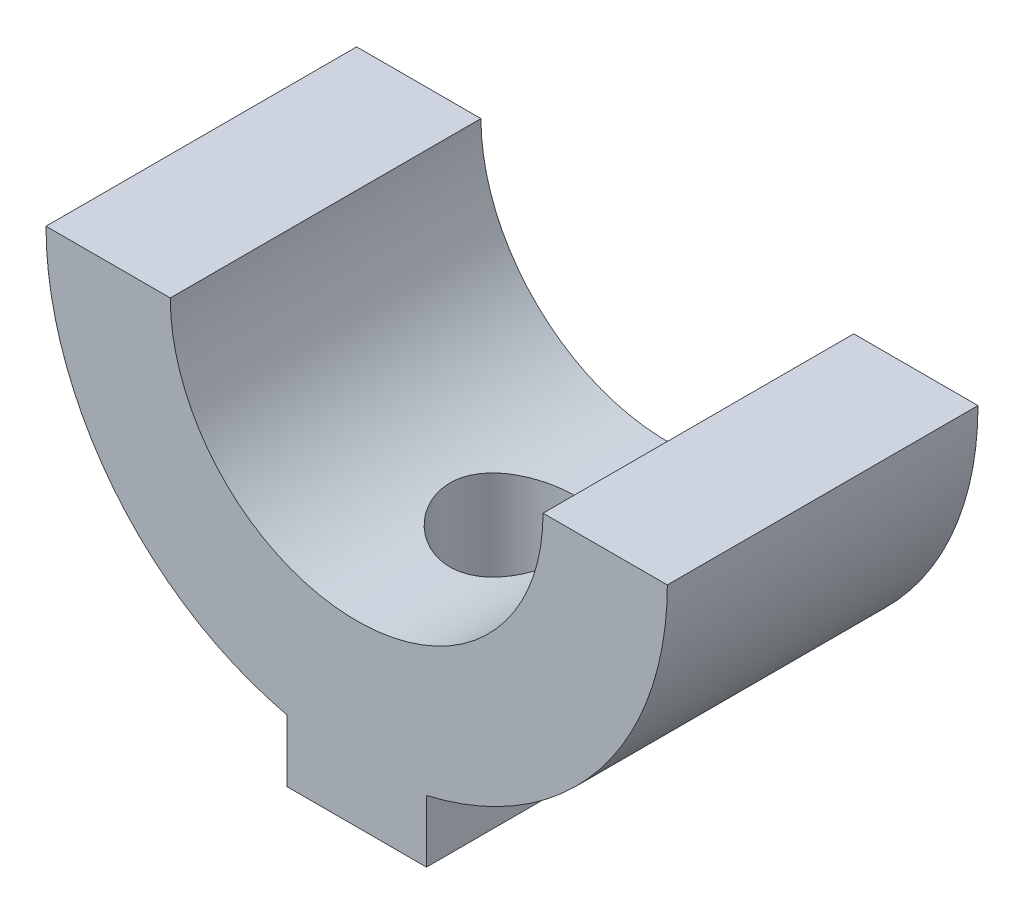
ISO-10303-21;
HEADER;
FILE_DESCRIPTION(('STEP AP214'),'2;1');
FILE_NAME('part.step','',(''),(''),'','','');
FILE_SCHEMA(('AUTOMOTIVE_DESIGN { 1 0 10303 214 1 1 1 1 }'));
ENDSEC;
DATA;
#1=APPLICATION_CONTEXT('core data for automotive mechanical design processes');
#2=APPLICATION_PROTOCOL_DEFINITION('international standard','automotive_design',2000,#1);
#3=PRODUCT_CONTEXT('',#1,'mechanical');
#4=PRODUCT('Part','Part','',(#3));
#5=PRODUCT_RELATED_PRODUCT_CATEGORY('part','',(#4));
#6=PRODUCT_DEFINITION_FORMATION('','',#4);
#7=PRODUCT_DEFINITION_CONTEXT('part definition',#1,'design');
#8=PRODUCT_DEFINITION('design','',#6,#7);
#9=PRODUCT_DEFINITION_SHAPE('','',#8);
#10=(LENGTH_UNIT() NAMED_UNIT(*) SI_UNIT(.MILLI.,.METRE.));
#11=(NAMED_UNIT(*) PLANE_ANGLE_UNIT() SI_UNIT($,.RADIAN.));
#12=(NAMED_UNIT(*) SI_UNIT($,.STERADIAN.) SOLID_ANGLE_UNIT());
#13=UNCERTAINTY_MEASURE_WITH_UNIT(LENGTH_MEASURE(1.E-05),#10,'distance_accuracy_value','');
#14=(GEOMETRIC_REPRESENTATION_CONTEXT(3) GLOBAL_UNCERTAINTY_ASSIGNED_CONTEXT((#13)) GLOBAL_UNIT_ASSIGNED_CONTEXT((#10,
#11,#12)) REPRESENTATION_CONTEXT('',''));
#15=CARTESIAN_POINT('',(0.,0.,0.));
#16=DIRECTION('',(0.,0.,1.));
#17=DIRECTION('',(1.,0.,0.));
#18=AXIS2_PLACEMENT_3D('',#15,#16,#17);
#19=CARTESIAN_POINT('',(-233.921678321678,34.6363636363637,2.5));
#20=DIRECTION('',(0.,0.,-1.));
#21=DIRECTION('',(-1.,0.,0.));
#22=AXIS2_PLACEMENT_3D('',#19,#20,#21);
#23=CYLINDRICAL_SURFACE('',#22,5.);
#24=CARTESIAN_POINT('',(-233.921678321678,34.6363636363637,-2.5));
#25=DIRECTION('',(0.,0.,1.));
#26=DIRECTION('',(1.,0.,0.));
#27=AXIS2_PLACEMENT_3D('',#24,#25,#26);
#28=CIRCLE('',#27,5.);
#29=CARTESIAN_POINT('',(-235.044811567083,29.764139122544,-2.5));
#30=VERTEX_POINT('',#29);
#31=CARTESIAN_POINT('',(-238.921678321678,34.6363636363637,-2.5));
#32=VERTEX_POINT('',#31);
#33=EDGE_CURVE('E146',#30,#32,#28,.F.);
#34=ORIENTED_EDGE('',*,*,#33,.F.);
#35=DIRECTION('',(0.,0.,-1.));
#36=VECTOR('',#35,1.);
#37=CARTESIAN_POINT('',(-235.044811567083,29.764139122544,2.5));
#38=LINE('',#37,#36);
#39=CARTESIAN_POINT('',(-235.044811567083,29.764139122544,2.5));
#40=VERTEX_POINT('',#39);
#41=EDGE_CURVE('E11',#40,#30,#38,.T.);
#42=ORIENTED_EDGE('',*,*,#41,.F.);
#43=CARTESIAN_POINT('',(-233.921678321678,34.6363636363637,2.5));
#44=DIRECTION('',(0.,0.,1.));
#45=DIRECTION('',(1.,0.,0.));
#46=AXIS2_PLACEMENT_3D('',#43,#44,#45);
#47=CIRCLE('',#46,5.);
#48=CARTESIAN_POINT('',(-238.921678321678,34.6363636363637,2.5));
#49=VERTEX_POINT('',#48);
#50=EDGE_CURVE('E173',#40,#49,#47,.F.);
#51=ORIENTED_EDGE('',*,*,#50,.T.);
#52=DIRECTION('',(0.,0.,-1.));
#53=VECTOR('',#52,1.);
#54=CARTESIAN_POINT('',(-238.921678321678,34.6363636363637,2.5));
#55=LINE('',#54,#53);
#56=EDGE_CURVE('E98',#49,#32,#55,.T.);
#57=ORIENTED_EDGE('',*,*,#56,.T.);
#58=EDGE_LOOP('',(#34,#42,#51,#57));
#59=FACE_BOUND('',#58,.T.);
#60=ADVANCED_FACE('F41',(#59),#23,.T.);
#61=CARTESIAN_POINT('',(-235.044811567083,0.,2.5));
#62=DIRECTION('',(-1.,0.,0.));
#63=DIRECTION('',(0.,0.,1.));
#64=AXIS2_PLACEMENT_3D('',#61,#62,#63);
#65=PLANE('',#64);
#66=DIRECTION('',(0.,1.,0.));
#67=VECTOR('',#66,1.);
#68=CARTESIAN_POINT('',(-235.044811567083,0.,-2.5));
#69=LINE('',#68,#67);
#70=CARTESIAN_POINT('',(-235.044811567083,28.764139122544,-2.5));
#71=VERTEX_POINT('',#70);
#72=EDGE_CURVE('E150',#71,#30,#69,.T.);
#73=ORIENTED_EDGE('',*,*,#72,.F.);
#74=DIRECTION('',(0.,0.,-1.));
#75=VECTOR('',#74,1.);
#76=CARTESIAN_POINT('',(-235.044811567083,28.764139122544,2.5));
#77=LINE('',#76,#75);
#78=CARTESIAN_POINT('',(-235.044811567083,28.764139122544,2.5));
#79=VERTEX_POINT('',#78);
#80=EDGE_CURVE('E56',#79,#71,#77,.T.);
#81=ORIENTED_EDGE('',*,*,#80,.F.);
#82=DIRECTION('',(0.,1.,0.));
#83=VECTOR('',#82,1.);
#84=CARTESIAN_POINT('',(-235.044811567083,0.,2.5));
#85=LINE('',#84,#83);
#86=EDGE_CURVE('E207',#79,#40,#85,.T.);
#87=ORIENTED_EDGE('',*,*,#86,.T.);
#88=ORIENTED_EDGE('',*,*,#41,.T.);
#89=EDGE_LOOP('',(#73,#81,#87,#88));
#90=FACE_BOUND('',#89,.T.);
#91=ADVANCED_FACE('F197',(#90),#65,.T.);
#92=CARTESIAN_POINT('',(0.,28.764139122544,2.5));
#93=DIRECTION('',(0.,-1.,0.));
#94=DIRECTION('',(0.,0.,-1.));
#95=AXIS2_PLACEMENT_3D('',#92,#93,#94);
#96=PLANE('',#95);
#97=CARTESIAN_POINT('',(-233.921678321678,28.764139122544,0.));
#98=DIRECTION('',(0.,-1.,0.));
#99=DIRECTION('',(0.,0.,-1.));
#100=AXIS2_PLACEMENT_3D('',#97,#98,#99);
#101=CIRCLE('',#100,0.999999999999998);
#102=CARTESIAN_POINT('',(-233.921678321678,28.764139122544,-0.999999999999998));
#103=VERTEX_POINT('',#102);
#104=EDGE_CURVE('E215',#103,#103,#101,.T.);
#105=ORIENTED_EDGE('',*,*,#104,.F.);
#106=EDGE_LOOP('',(#105));
#107=FACE_BOUND('',#106,.T.);
#108=DIRECTION('',(-1.,0.,0.));
#109=VECTOR('',#108,1.);
#110=CARTESIAN_POINT('',(0.,28.764139122544,-2.5));
#111=LINE('',#110,#109);
#112=CARTESIAN_POINT('',(-232.798545076273,28.764139122544,-2.5));
#113=VERTEX_POINT('',#112);
#114=EDGE_CURVE('E154',#113,#71,#111,.T.);
#115=ORIENTED_EDGE('',*,*,#114,.F.);
#116=DIRECTION('',(0.,0.,-1.));
#117=VECTOR('',#116,1.);
#118=CARTESIAN_POINT('',(-232.798545076273,28.764139122544,2.5));
#119=LINE('',#118,#117);
#120=CARTESIAN_POINT('',(-232.798545076273,28.764139122544,2.5));
#121=VERTEX_POINT('',#120);
#122=EDGE_CURVE('E183',#121,#113,#119,.T.);
#123=ORIENTED_EDGE('',*,*,#122,.F.);
#124=DIRECTION('',(-1.,0.,0.));
#125=VECTOR('',#124,1.);
#126=CARTESIAN_POINT('',(0.,28.764139122544,2.5));
#127=LINE('',#126,#125);
#128=EDGE_CURVE('E193',#121,#79,#127,.T.);
#129=ORIENTED_EDGE('',*,*,#128,.T.);
#130=ORIENTED_EDGE('',*,*,#80,.T.);
#131=EDGE_LOOP('',(#115,#123,#129,#130));
#132=FACE_BOUND('',#131,.T.);
#133=ADVANCED_FACE('F191',(#107,#132),#96,.T.);
#134=CARTESIAN_POINT('',(-232.798545076273,0.,2.5));
#135=DIRECTION('',(-1.,0.,0.));
#136=DIRECTION('',(0.,0.,1.));
#137=AXIS2_PLACEMENT_3D('',#134,#135,#136);
#138=PLANE('',#137);
#139=DIRECTION('',(0.,1.,0.));
#140=VECTOR('',#139,1.);
#141=CARTESIAN_POINT('',(-232.798545076273,0.,-2.5));
#142=LINE('',#141,#140);
#143=CARTESIAN_POINT('',(-232.798545076273,29.764139122544,-2.5));
#144=VERTEX_POINT('',#143);
#145=EDGE_CURVE('E158',#113,#144,#142,.T.);
#146=ORIENTED_EDGE('',*,*,#145,.T.);
#147=DIRECTION('',(0.,0.,-1.));
#148=VECTOR('',#147,1.);
#149=CARTESIAN_POINT('',(-232.798545076273,29.764139122544,2.5));
#150=LINE('',#149,#148);
#151=CARTESIAN_POINT('',(-232.798545076273,29.764139122544,2.5));
#152=VERTEX_POINT('',#151);
#153=EDGE_CURVE('E180',#152,#144,#150,.T.);
#154=ORIENTED_EDGE('',*,*,#153,.F.);
#155=DIRECTION('',(0.,1.,0.));
#156=VECTOR('',#155,1.);
#157=CARTESIAN_POINT('',(-232.798545076273,0.,2.5));
#158=LINE('',#157,#156);
#159=EDGE_CURVE('E140',#121,#152,#158,.T.);
#160=ORIENTED_EDGE('',*,*,#159,.F.);
#161=ORIENTED_EDGE('',*,*,#122,.T.);
#162=EDGE_LOOP('',(#146,#154,#160,#161));
#163=FACE_BOUND('',#162,.T.);
#164=ADVANCED_FACE('F204',(#163),#138,.F.);
#165=CARTESIAN_POINT('',(-233.921678321678,34.6363636363637,2.5));
#166=DIRECTION('',(0.,0.,-1.));
#167=DIRECTION('',(-1.,0.,0.));
#168=AXIS2_PLACEMENT_3D('',#165,#166,#167);
#169=CYLINDRICAL_SURFACE('',#168,5.);
#170=CARTESIAN_POINT('',(-233.921678321678,34.6363636363637,-2.5));
#171=DIRECTION('',(0.,0.,1.));
#172=DIRECTION('',(1.,0.,0.));
#173=AXIS2_PLACEMENT_3D('',#170,#171,#172);
#174=CIRCLE('',#173,5.);
#175=CARTESIAN_POINT('',(-228.921678321678,34.6363636363637,-2.5));
#176=VERTEX_POINT('',#175);
#177=EDGE_CURVE('E162',#176,#144,#174,.F.);
#178=ORIENTED_EDGE('',*,*,#177,.F.);
#179=DIRECTION('',(0.,0.,-1.));
#180=VECTOR('',#179,1.);
#181=CARTESIAN_POINT('',(-228.921678321678,34.6363636363637,2.5));
#182=LINE('',#181,#180);
#183=CARTESIAN_POINT('',(-228.921678321678,34.6363636363637,2.5));
#184=VERTEX_POINT('',#183);
#185=EDGE_CURVE('E126',#184,#176,#182,.T.);
#186=ORIENTED_EDGE('',*,*,#185,.F.);
#187=CARTESIAN_POINT('',(-233.921678321678,34.6363636363637,2.5));
#188=DIRECTION('',(0.,0.,1.));
#189=DIRECTION('',(1.,0.,0.));
#190=AXIS2_PLACEMENT_3D('',#187,#188,#189);
#191=CIRCLE('',#190,5.);
#192=EDGE_CURVE('E136',#184,#152,#191,.F.);
#193=ORIENTED_EDGE('',*,*,#192,.T.);
#194=ORIENTED_EDGE('',*,*,#153,.T.);
#195=EDGE_LOOP('',(#178,#186,#193,#194));
#196=FACE_BOUND('',#195,.T.);
#197=ADVANCED_FACE('F250',(#196),#169,.T.);
#198=CARTESIAN_POINT('',(-1.20169026244942E-13,34.6363636363645,2.5));
#199=DIRECTION('',(0.,1.,0.));
#200=DIRECTION('',(-1.,0.,0.));
#201=AXIS2_PLACEMENT_3D('',#198,#199,#200);
#202=PLANE('',#201);
#203=DIRECTION('',(1.,0.,0.));
#204=VECTOR('',#203,1.);
#205=CARTESIAN_POINT('',(-1.20169026244942E-13,34.6363636363645,-2.5));
#206=LINE('',#205,#204);
#207=CARTESIAN_POINT('',(-230.921678321678,34.6363636363637,-2.5));
#208=VERTEX_POINT('',#207);
#209=EDGE_CURVE('E124',#208,#176,#206,.T.);
#210=ORIENTED_EDGE('',*,*,#209,.F.);
#211=DIRECTION('',(0.,0.,-1.));
#212=VECTOR('',#211,1.);
#213=CARTESIAN_POINT('',(-230.921678321678,34.6363636363637,2.5));
#214=LINE('',#213,#212);
#215=CARTESIAN_POINT('',(-230.921678321678,34.6363636363637,2.5));
#216=VERTEX_POINT('',#215);
#217=EDGE_CURVE('E118',#216,#208,#214,.T.);
#218=ORIENTED_EDGE('',*,*,#217,.F.);
#219=DIRECTION('',(1.,0.,0.));
#220=VECTOR('',#219,1.);
#221=CARTESIAN_POINT('',(-1.20169026244942E-13,34.6363636363645,2.5));
#222=LINE('',#221,#220);
#223=EDGE_CURVE('E122',#216,#184,#222,.T.);
#224=ORIENTED_EDGE('',*,*,#223,.T.);
#225=ORIENTED_EDGE('',*,*,#185,.T.);
#226=EDGE_LOOP('',(#210,#218,#224,#225));
#227=FACE_BOUND('',#226,.T.);
#228=ADVANCED_FACE('F120',(#227),#202,.T.);
#229=CARTESIAN_POINT('',(-233.921678321678,34.6363636363637,2.5));
#230=DIRECTION('',(0.,0.,-1.));
#231=DIRECTION('',(-1.,0.,0.));
#232=AXIS2_PLACEMENT_3D('',#229,#230,#231);
#233=CYLINDRICAL_SURFACE('',#232,3.);
#234=CARTESIAN_POINT('',(-233.921678321678,31.6363636363637,-0.999999999999998));
#235=CARTESIAN_POINT('',(-233.867114958791,31.6363634833542,-1.00000025373164));
#236=CARTESIAN_POINT('',(-233.81255312714,31.6378659412882,-0.995519733872781));
#237=CARTESIAN_POINT('',(-233.705036560805,31.6437115343308,-0.977770891182778));
#238=CARTESIAN_POINT('',(-233.652081993559,31.6480549643421,-0.964501656051076));
#239=CARTESIAN_POINT('',(-233.549345532176,31.6591105572992,-0.929680756615949));
#240=CARTESIAN_POINT('',(-233.499558495792,31.6658187590551,-0.908142937540722));
#241=CARTESIAN_POINT('',(-233.404303384873,31.6809191791902,-0.857458827161645));
#242=CARTESIAN_POINT('',(-233.358836164719,31.6893117296859,-0.828311034997392));
#243=CARTESIAN_POINT('',(-233.271936646656,31.7072226919336,-0.762174195141238));
#244=CARTESIAN_POINT('',(-233.23067462138,31.7167680717258,-0.724968765739493));
#245=CARTESIAN_POINT('',(-233.154845628976,31.7357604885324,-0.644232845293419));
#246=CARTESIAN_POINT('',(-233.120280136189,31.7452075034582,-0.600700965071475));
#247=CARTESIAN_POINT('',(-233.05785337945,31.7632303115909,-0.507014884803539));
#248=CARTESIAN_POINT('',(-233.030213463457,31.7717732436068,-0.456706260267884));
#249=CARTESIAN_POINT('',(-232.983859447801,31.7866105821776,-0.351823905541468));
#250=CARTESIAN_POINT('',(-232.965142624291,31.7929056747562,-0.297251482837272));
#251=CARTESIAN_POINT('',(-232.937804860169,31.8022506036699,-0.187326778503304));
#252=CARTESIAN_POINT('',(-232.928864873406,31.8054026786675,-0.132062791510948));
#253=CARTESIAN_POINT('',(-232.920337198344,31.8084070700686,-0.0207362458441263));
#254=CARTESIAN_POINT('',(-232.920746620073,31.8082604061363,0.0353260607091874));
#255=CARTESIAN_POINT('',(-232.930658417975,31.8047734862818,0.143936630444021));
#256=CARTESIAN_POINT('',(-232.939744408511,31.8015794776883,0.196528402919018));
#257=CARTESIAN_POINT('',(-232.966072158829,31.7925970591181,0.299393419606831));
#258=CARTESIAN_POINT('',(-232.983314895086,31.7868083385226,0.349666385435065));
#259=CARTESIAN_POINT('',(-233.025739263618,31.7731845250512,0.447412749591477));
#260=CARTESIAN_POINT('',(-233.051044272971,31.7653179784325,0.494828025469528));
#261=CARTESIAN_POINT('',(-233.108789215375,31.7484380506064,0.584870908279726));
#262=CARTESIAN_POINT('',(-233.141231209314,31.739424338459,0.627497126933374));
#263=CARTESIAN_POINT('',(-233.214328988996,31.7206903446862,0.709091598160772));
#264=CARTESIAN_POINT('',(-233.255325171602,31.7109577428152,0.747752694509081));
#265=CARTESIAN_POINT('',(-233.343338751708,31.6922942524933,0.817731266663409));
#266=CARTESIAN_POINT('',(-233.390356726017,31.683363440983,0.849048038164499));
#267=CARTESIAN_POINT('',(-233.489730708632,31.6671925569857,0.90369630023507));
#268=CARTESIAN_POINT('',(-233.542135045262,31.6599701362833,0.926945491340735));
#269=CARTESIAN_POINT('',(-233.650409238314,31.6481579649193,0.964203173955714));
#270=CARTESIAN_POINT('',(-233.706277883523,31.6435672998149,0.978214875423438));
#271=CARTESIAN_POINT('',(-233.817294492149,31.6376873656492,0.996055666022354));
#272=CARTESIAN_POINT('',(-233.872368721813,31.6362636180264,1.00029980917275));
#273=CARTESIAN_POINT('',(-233.982453391638,31.6364746094154,0.999667326401532));
#274=CARTESIAN_POINT('',(-234.037463840998,31.6381088321701,0.99479224002013));
#275=CARTESIAN_POINT('',(-234.144198187982,31.6441633891925,0.976388092264028));
#276=CARTESIAN_POINT('',(-234.195971128513,31.6485016492514,0.96311379395047));
#277=CARTESIAN_POINT('',(-234.296534280258,31.6594451680633,0.928606555533296));
#278=CARTESIAN_POINT('',(-234.345324110187,31.6660507158982,0.907372600532321));
#279=CARTESIAN_POINT('',(-234.439966618072,31.6810743234894,0.856929568159099));
#280=CARTESIAN_POINT('',(-234.485708280896,31.6895354888006,0.827525406716401));
#281=CARTESIAN_POINT('',(-234.571743151814,31.7073110972062,0.761805849986952));
#282=CARTESIAN_POINT('',(-234.612034689473,31.7166258004448,0.72548834396985));
#283=CARTESIAN_POINT('',(-234.687930829485,31.7355951565389,0.645021248991754));
#284=CARTESIAN_POINT('',(-234.723239290927,31.7452460254121,0.60059077306677));
#285=CARTESIAN_POINT('',(-234.785935843999,31.7633639034938,0.506228432195509));
#286=CARTESIAN_POINT('',(-234.813323869599,31.7718309028324,0.456296521389795));
#287=CARTESIAN_POINT('',(-234.859275252102,31.7865397181606,0.352326984693395));
#288=CARTESIAN_POINT('',(-234.877856453876,31.7927860273573,0.298297920757214));
#289=CARTESIAN_POINT('',(-234.90557298847,31.8022553123723,0.187621349875848));
#290=CARTESIAN_POINT('',(-234.914712576639,31.8054796501367,0.130975034566936));
#291=CARTESIAN_POINT('',(-234.922954604149,31.8083850476129,0.0198029039867892));
#292=CARTESIAN_POINT('',(-234.922548578989,31.8082396329207,-0.034682340251736));
#293=CARTESIAN_POINT('',(-234.912920615133,31.8048509371281,-0.142765074899742));
#294=CARTESIAN_POINT('',(-234.903699201137,31.8016078404048,-0.19636261795291));
#295=CARTESIAN_POINT('',(-234.877050134805,31.7925183935742,-0.300135663012664));
#296=CARTESIAN_POINT('',(-234.859781667693,31.7867226562085,-0.350356825007225));
#297=CARTESIAN_POINT('',(-234.817657687439,31.7731996481093,-0.447227406935527));
#298=CARTESIAN_POINT('',(-234.792800490232,31.7654719487107,-0.493876031187258));
#299=CARTESIAN_POINT('',(-234.734939014261,31.7485353441231,-0.584483669923692));
#300=CARTESIAN_POINT('',(-234.701626564443,31.7392765199476,-0.628236501898591));
#301=CARTESIAN_POINT('',(-234.628321204814,31.7205300735258,-0.709689813383985));
#302=CARTESIAN_POINT('',(-234.58832640613,31.7110423872385,-0.747388575688014));
#303=CARTESIAN_POINT('',(-234.500919878599,31.6924633311097,-0.817144412289239));
#304=CARTESIAN_POINT('',(-234.453279835178,31.6834018183515,-0.848924347751021));
#305=CARTESIAN_POINT('',(-234.353035679085,31.6671037246371,-0.903990428850636));
#306=CARTESIAN_POINT('',(-234.300432839811,31.6598666772842,-0.927278745922039));
#307=CARTESIAN_POINT('',(-234.194171968879,31.6483084856783,-0.963721632488672));
#308=CARTESIAN_POINT('',(-234.140666079355,31.6438715121385,-0.977282466263374));
#309=CARTESIAN_POINT('',(-234.031998737688,31.6378995657214,-0.995420280677124));
#310=CARTESIAN_POINT('',(-233.976837747247,31.6363637910446,-0.999999743496535));
#311=CARTESIAN_POINT('',(-233.921678321678,31.6363636363637,-0.999999999999998));
#312=B_SPLINE_CURVE_WITH_KNOTS('',3,(#234,#235,#236,#237,#238,#239,#240,#241,#242,#243,#244,
#245,#246,#247,#248,#249,#250,#251,#252,#253,#254,#255,#256,#257,#258,#259,#260,#261,#262,#263,
#264,#265,#266,#267,#268,#269,#270,#271,#272,#273,#274,#275,#276,#277,#278,#279,#280,#281,#282,
#283,#284,#285,#286,#287,#288,#289,#290,#291,#292,#293,#294,#295,#296,#297,#298,#299,#300,#301,
#302,#303,#304,#305,#306,#307,#308,#309,#310,#311),.UNSPECIFIED.,.T.,.F.,(4,2,2,2,2,2,2,2,2,2,2,
2,2,2,2,2,2,2,2,2,2,2,2,2,2,2,2,2,2,2,2,2,2,2,2,2,2,2,4),(0.,0.163487106026024,
0.326991185267516,0.490222672870279,0.65348637779912,0.82184684282757,0.990244332875299,
1.16348384823468,1.33667044692831,1.50401925741838,1.67131633987485,1.8309682655128,
1.9906393085548,2.1528817115513,2.31517102558206,2.4859330581137,2.65671145966616,
2.82918405650357,3.00159668877209,3.16653583175169,3.33144713164177,3.49158157978212,
3.65173645284103,3.81610399843736,3.98052180821887,4.15241022880748,4.32430008234997,
4.49584013824416,4.66730284700844,4.82995666056617,4.99260079341184,5.15215587070225,
5.31174638165786,5.47830066681613,5.64490211113588,5.81799660824911,5.99104681142267,
6.15636558363622,6.32163866027948),.UNSPECIFIED.);
#313=CARTESIAN_POINT('',(-233.921678321678,31.6363636363637,-0.999999999999998));
#314=VERTEX_POINT('',#313);
#315=EDGE_CURVE('E44',#314,#314,#312,.T.);
#316=ORIENTED_EDGE('',*,*,#315,.T.);
#317=EDGE_LOOP('',(#316));
#318=FACE_BOUND('',#317,.T.);
#319=CARTESIAN_POINT('',(-233.921678321678,34.6363636363637,-2.5));
#320=DIRECTION('',(0.,0.,1.));
#321=DIRECTION('',(1.,0.,0.));
#322=AXIS2_PLACEMENT_3D('',#319,#320,#321);
#323=CIRCLE('',#322,3.);
#324=CARTESIAN_POINT('',(-236.921678321678,34.6363636363636,-2.5));
#325=VERTEX_POINT('',#324);
#326=EDGE_CURVE('E91',#208,#325,#323,.F.);
#327=ORIENTED_EDGE('',*,*,#326,.T.);
#328=DIRECTION('',(0.,0.,-1.));
#329=VECTOR('',#328,1.);
#330=CARTESIAN_POINT('',(-236.921678321678,34.6363636363636,2.5));
#331=LINE('',#330,#329);
#332=CARTESIAN_POINT('',(-236.921678321678,34.6363636363636,2.5));
#333=VERTEX_POINT('',#332);
#334=EDGE_CURVE('E127',#333,#325,#331,.T.);
#335=ORIENTED_EDGE('',*,*,#334,.F.);
#336=CARTESIAN_POINT('',(-233.921678321678,34.6363636363637,2.5));
#337=DIRECTION('',(0.,0.,1.));
#338=DIRECTION('',(1.,0.,0.));
#339=AXIS2_PLACEMENT_3D('',#336,#337,#338);
#340=CIRCLE('',#339,3.);
#341=EDGE_CURVE('E129',#216,#333,#340,.F.);
#342=ORIENTED_EDGE('',*,*,#341,.F.);
#343=ORIENTED_EDGE('',*,*,#217,.T.);
#344=EDGE_LOOP('',(#327,#335,#342,#343));
#345=FACE_BOUND('',#344,.T.);
#346=ADVANCED_FACE('F130',(#318,#345),#233,.F.);
#347=CARTESIAN_POINT('',(7.21014157469529E-13,34.6363636363587,2.5));
#348=DIRECTION('',(0.,-1.,0.));
#349=DIRECTION('',(1.,0.,0.));
#350=AXIS2_PLACEMENT_3D('',#347,#348,#349);
#351=PLANE('',#350);
#352=DIRECTION('',(-1.,0.,0.));
#353=VECTOR('',#352,1.);
#354=CARTESIAN_POINT('',(7.21014157469529E-13,34.6363636363587,-2.5));
#355=LINE('',#354,#353);
#356=EDGE_CURVE('E170',#325,#32,#355,.T.);
#357=ORIENTED_EDGE('',*,*,#356,.T.);
#358=ORIENTED_EDGE('',*,*,#56,.F.);
#359=DIRECTION('',(-1.,0.,0.));
#360=VECTOR('',#359,1.);
#361=CARTESIAN_POINT('',(7.21014157469529E-13,34.6363636363587,2.5));
#362=LINE('',#361,#360);
#363=EDGE_CURVE('E64',#333,#49,#362,.T.);
#364=ORIENTED_EDGE('',*,*,#363,.F.);
#365=ORIENTED_EDGE('',*,*,#334,.T.);
#366=EDGE_LOOP('',(#357,#358,#364,#365));
#367=FACE_BOUND('',#366,.T.);
#368=ADVANCED_FACE('F239',(#367),#351,.F.);
#369=CARTESIAN_POINT('',(0.,0.,2.5));
#370=DIRECTION('',(0.,0.,1.));
#371=DIRECTION('',(1.,0.,0.));
#372=AXIS2_PLACEMENT_3D('',#369,#370,#371);
#373=PLANE('',#372);
#374=ORIENTED_EDGE('',*,*,#50,.F.);
#375=ORIENTED_EDGE('',*,*,#86,.F.);
#376=ORIENTED_EDGE('',*,*,#128,.F.);
#377=ORIENTED_EDGE('',*,*,#159,.T.);
#378=ORIENTED_EDGE('',*,*,#192,.F.);
#379=ORIENTED_EDGE('',*,*,#223,.F.);
#380=ORIENTED_EDGE('',*,*,#341,.T.);
#381=ORIENTED_EDGE('',*,*,#363,.T.);
#382=EDGE_LOOP('',(#374,#375,#376,#377,#378,#379,#380,#381));
#383=FACE_BOUND('',#382,.T.);
#384=ADVANCED_FACE('F134',(#383),#373,.T.);
#385=CARTESIAN_POINT('',(0.,0.,-2.5));
#386=DIRECTION('',(0.,0.,1.));
#387=DIRECTION('',(1.,0.,0.));
#388=AXIS2_PLACEMENT_3D('',#385,#386,#387);
#389=PLANE('',#388);
#390=ORIENTED_EDGE('',*,*,#33,.T.);
#391=ORIENTED_EDGE('',*,*,#356,.F.);
#392=ORIENTED_EDGE('',*,*,#326,.F.);
#393=ORIENTED_EDGE('',*,*,#209,.T.);
#394=ORIENTED_EDGE('',*,*,#177,.T.);
#395=ORIENTED_EDGE('',*,*,#145,.F.);
#396=ORIENTED_EDGE('',*,*,#114,.T.);
#397=ORIENTED_EDGE('',*,*,#72,.T.);
#398=EDGE_LOOP('',(#390,#391,#392,#393,#394,#395,#396,#397));
#399=FACE_BOUND('',#398,.T.);
#400=ADVANCED_FACE('F200',(#399),#389,.F.);
#401=CARTESIAN_POINT('',(-233.921678321678,33.764139122544,0.));
#402=DIRECTION('',(0.,-1.,0.));
#403=DIRECTION('',(0.,0.,-1.));
#404=AXIS2_PLACEMENT_3D('',#401,#402,#403);
#405=CYLINDRICAL_SURFACE('',#404,0.999999999999998);
#406=ORIENTED_EDGE('',*,*,#104,.T.);
#407=EDGE_LOOP('',(#406));
#408=FACE_BOUND('',#407,.T.);
#409=ORIENTED_EDGE('',*,*,#315,.F.);
#410=EDGE_LOOP('',(#409));
#411=FACE_BOUND('',#410,.T.);
#412=ADVANCED_FACE('F225',(#408,#411),#405,.F.);
#413=CLOSED_SHELL('',(#60,#91,#133,#164,#197,#228,#346,#368,#384,#400,#412));
#414=MANIFOLD_SOLID_BREP('B2',#413);
#415=ADVANCED_BREP_SHAPE_REPRESENTATION('',(#18,#414),#14);
#416=SHAPE_DEFINITION_REPRESENTATION(#9,#415);
ENDSEC;
END-ISO-10303-21;
